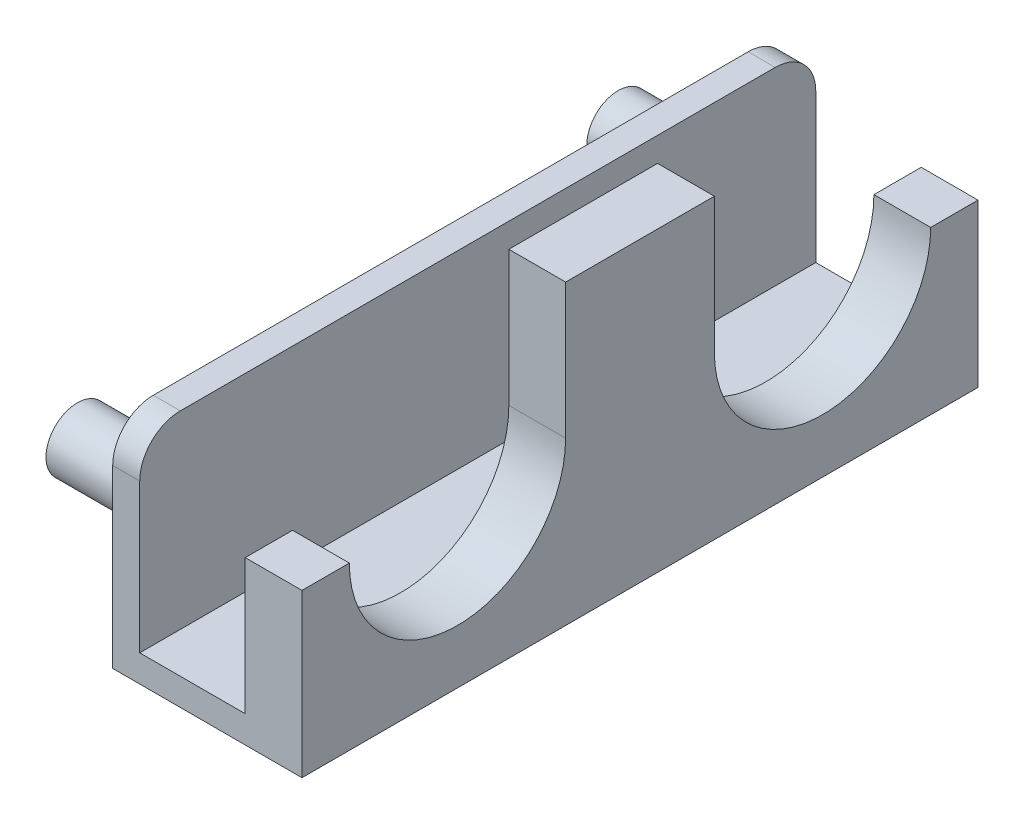
ISO-10303-21;
HEADER;
FILE_DESCRIPTION(('STEP AP214'),'2;1');
FILE_NAME('part.step','',(''),(''),'','','');
FILE_SCHEMA(('AUTOMOTIVE_DESIGN { 1 0 10303 214 1 1 1 1 }'));
ENDSEC;
DATA;
#1=APPLICATION_CONTEXT('core data for automotive mechanical design processes');
#2=APPLICATION_PROTOCOL_DEFINITION('international standard','automotive_design',2000,#1);
#3=PRODUCT_CONTEXT('',#1,'mechanical');
#4=PRODUCT('Part','Part','',(#3));
#5=PRODUCT_RELATED_PRODUCT_CATEGORY('part','',(#4));
#6=PRODUCT_DEFINITION_FORMATION('','',#4);
#7=PRODUCT_DEFINITION_CONTEXT('part definition',#1,'design');
#8=PRODUCT_DEFINITION('design','',#6,#7);
#9=PRODUCT_DEFINITION_SHAPE('','',#8);
#10=(LENGTH_UNIT() NAMED_UNIT(*) SI_UNIT(.MILLI.,.METRE.));
#11=(NAMED_UNIT(*) PLANE_ANGLE_UNIT() SI_UNIT($,.RADIAN.));
#12=(NAMED_UNIT(*) SI_UNIT($,.STERADIAN.) SOLID_ANGLE_UNIT());
#13=UNCERTAINTY_MEASURE_WITH_UNIT(LENGTH_MEASURE(1.E-05),#10,'distance_accuracy_value','');
#14=(GEOMETRIC_REPRESENTATION_CONTEXT(3) GLOBAL_UNCERTAINTY_ASSIGNED_CONTEXT((#13)) GLOBAL_UNIT_ASSIGNED_CONTEXT((#10,
#11,#12)) REPRESENTATION_CONTEXT('',''));
#15=CARTESIAN_POINT('',(0.,0.,0.));
#16=DIRECTION('',(0.,0.,1.));
#17=DIRECTION('',(1.,0.,0.));
#18=AXIS2_PLACEMENT_3D('',#15,#16,#17);
#19=CARTESIAN_POINT('',(0.,35.7792408647816,0.));
#20=DIRECTION('',(0.,-1.,0.));
#21=DIRECTION('',(0.,0.,-1.));
#22=AXIS2_PLACEMENT_3D('',#19,#20,#21);
#23=PLANE('',#22);
#24=DIRECTION('',(0.,0.,1.));
#25=VECTOR('',#24,1.);
#26=CARTESIAN_POINT('',(9.8,35.7792408647816,-112.54197556329));
#27=LINE('',#26,#25);
#28=CARTESIAN_POINT('',(9.8,35.7792408647816,-93.0419755632896));
#29=VERTEX_POINT('',#28);
#30=CARTESIAN_POINT('',(9.8,35.7792408647816,-82.0419755632896));
#31=VERTEX_POINT('',#30);
#32=EDGE_CURVE('E287',#29,#31,#27,.T.);
#33=ORIENTED_EDGE('',*,*,#32,.T.);
#34=DIRECTION('',(1.,0.,0.));
#35=VECTOR('',#34,1.);
#36=CARTESIAN_POINT('',(9.8,35.7792408647816,-82.0419755632896));
#37=LINE('',#36,#35);
#38=CARTESIAN_POINT('',(14.,35.7792408647816,-82.0419755632896));
#39=VERTEX_POINT('',#38);
#40=EDGE_CURVE('E499',#31,#39,#37,.T.);
#41=ORIENTED_EDGE('',*,*,#40,.T.);
#42=DIRECTION('',(0.,0.,-1.));
#43=VECTOR('',#42,1.);
#44=CARTESIAN_POINT('',(14.,35.7792408647816,-112.54197556329));
#45=LINE('',#44,#43);
#46=CARTESIAN_POINT('',(14.,35.7792408647816,-93.0419755632896));
#47=VERTEX_POINT('',#46);
#48=EDGE_CURVE('E284',#39,#47,#45,.T.);
#49=ORIENTED_EDGE('',*,*,#48,.T.);
#50=DIRECTION('',(1.,0.,0.));
#51=VECTOR('',#50,1.);
#52=CARTESIAN_POINT('',(9.8,35.7792408647816,-93.0419755632896));
#53=LINE('',#52,#51);
#54=EDGE_CURVE('E486',#29,#47,#53,.T.);
#55=ORIENTED_EDGE('',*,*,#54,.F.);
#56=EDGE_LOOP('',(#33,#41,#49,#55));
#57=FACE_BOUND('',#56,.T.);
#58=ADVANCED_FACE('F33',(#57),#23,.F.);
#59=CARTESIAN_POINT('',(14.,15.7792408647816,-62.5419755632896));
#60=DIRECTION('',(0.,-1.,0.));
#61=DIRECTION('',(0.,0.,-1.));
#62=AXIS2_PLACEMENT_3D('',#59,#60,#61);
#63=PLANE('',#62);
#64=DIRECTION('',(0.,0.,1.));
#65=VECTOR('',#64,1.);
#66=CARTESIAN_POINT('',(9.8,15.7792408647816,-112.54197556329));
#67=LINE('',#66,#65);
#68=CARTESIAN_POINT('',(9.8,15.7792408647816,-112.54197556329));
#69=VERTEX_POINT('',#68);
#70=CARTESIAN_POINT('',(9.80000000000001,15.7792408647816,-62.5419755632896));
#71=VERTEX_POINT('',#70);
#72=EDGE_CURVE('E277',#69,#71,#67,.T.);
#73=ORIENTED_EDGE('',*,*,#72,.F.);
#74=DIRECTION('',(-1.,0.,0.));
#75=VECTOR('',#74,1.);
#76=CARTESIAN_POINT('',(14.,15.7792408647816,-112.54197556329));
#77=LINE('',#76,#75);
#78=CARTESIAN_POINT('',(2.,15.7792408647816,-112.54197556329));
#79=VERTEX_POINT('',#78);
#80=EDGE_CURVE('E190',#69,#79,#77,.T.);
#81=ORIENTED_EDGE('',*,*,#80,.T.);
#82=DIRECTION('',(0.,0.,1.));
#83=VECTOR('',#82,1.);
#84=CARTESIAN_POINT('',(2.,15.7792408647816,-62.5419755632896));
#85=LINE('',#84,#83);
#86=CARTESIAN_POINT('',(2.,15.7792408647816,-62.5419755632896));
#87=VERTEX_POINT('',#86);
#88=EDGE_CURVE('E175',#79,#87,#85,.T.);
#89=ORIENTED_EDGE('',*,*,#88,.T.);
#90=DIRECTION('',(-1.,0.,0.));
#91=VECTOR('',#90,1.);
#92=CARTESIAN_POINT('',(14.,15.7792408647816,-62.5419755632896));
#93=LINE('',#92,#91);
#94=EDGE_CURVE('E186',#71,#87,#93,.T.);
#95=ORIENTED_EDGE('',*,*,#94,.F.);
#96=EDGE_LOOP('',(#73,#81,#89,#95));
#97=FACE_BOUND('',#96,.T.);
#98=ADVANCED_FACE('F298',(#97),#63,.F.);
#99=CARTESIAN_POINT('',(2.,0.,0.));
#100=DIRECTION('',(-1.,0.,0.));
#101=DIRECTION('',(0.,0.,1.));
#102=AXIS2_PLACEMENT_3D('',#99,#100,#101);
#103=PLANE('',#102);
#104=DIRECTION('',(0.,0.,1.));
#105=VECTOR('',#104,1.);
#106=CARTESIAN_POINT('',(2.,29.7792408647816,-112.54197556329));
#107=LINE('',#106,#105);
#108=CARTESIAN_POINT('',(2.,29.7792408647816,-109.54197556329));
#109=VERTEX_POINT('',#108);
#110=CARTESIAN_POINT('',(2.,29.7792408647816,-65.5419755632896));
#111=VERTEX_POINT('',#110);
#112=EDGE_CURVE('E207',#109,#111,#107,.T.);
#113=ORIENTED_EDGE('',*,*,#112,.T.);
#114=CARTESIAN_POINT('',(2.,26.7792408647816,-65.5419755632896));
#115=DIRECTION('',(-1.,0.,0.));
#116=DIRECTION('',(0.,0.,1.));
#117=AXIS2_PLACEMENT_3D('',#114,#115,#116);
#118=CIRCLE('',#117,3.);
#119=CARTESIAN_POINT('',(2.,26.7792408647816,-62.5419755632896));
#120=VERTEX_POINT('',#119);
#121=EDGE_CURVE('E41',#111,#120,#118,.F.);
#122=ORIENTED_EDGE('',*,*,#121,.T.);
#123=DIRECTION('',(0.,-1.,0.));
#124=VECTOR('',#123,1.);
#125=CARTESIAN_POINT('',(2.,29.7792408647816,-62.5419755632896));
#126=LINE('',#125,#124);
#127=EDGE_CURVE('E210',#120,#87,#126,.T.);
#128=ORIENTED_EDGE('',*,*,#127,.T.);
#129=ORIENTED_EDGE('',*,*,#88,.F.);
#130=DIRECTION('',(0.,1.,0.));
#131=VECTOR('',#130,1.);
#132=CARTESIAN_POINT('',(2.,29.7792408647816,-112.54197556329));
#133=LINE('',#132,#131);
#134=CARTESIAN_POINT('',(2.,26.7792408647816,-112.54197556329));
#135=VERTEX_POINT('',#134);
#136=EDGE_CURVE('E205',#79,#135,#133,.T.);
#137=ORIENTED_EDGE('',*,*,#136,.T.);
#138=CARTESIAN_POINT('',(2.,26.7792408647816,-109.54197556329));
#139=DIRECTION('',(-1.,0.,0.));
#140=DIRECTION('',(0.,0.,1.));
#141=AXIS2_PLACEMENT_3D('',#138,#139,#140);
#142=CIRCLE('',#141,3.);
#143=EDGE_CURVE('E233',#135,#109,#142,.F.);
#144=ORIENTED_EDGE('',*,*,#143,.T.);
#145=EDGE_LOOP('',(#113,#122,#128,#129,#137,#144));
#146=FACE_BOUND('',#145,.T.);
#147=ADVANCED_FACE('F237',(#146),#103,.F.);
#148=CARTESIAN_POINT('',(2.,29.7792408647816,-112.54197556329));
#149=DIRECTION('',(0.,0.,1.));
#150=DIRECTION('',(1.,0.,0.));
#151=AXIS2_PLACEMENT_3D('',#148,#149,#150);
#152=PLANE('',#151);
#153=DIRECTION('',(0.,-1.,0.));
#154=VECTOR('',#153,1.);
#155=CARTESIAN_POINT('',(9.8,35.7792408647816,-112.54197556329));
#156=LINE('',#155,#154);
#157=CARTESIAN_POINT('',(9.8,25.7792408647816,-112.54197556329));
#158=VERTEX_POINT('',#157);
#159=EDGE_CURVE('E180',#158,#69,#156,.T.);
#160=ORIENTED_EDGE('',*,*,#159,.F.);
#161=DIRECTION('',(1.,0.,0.));
#162=VECTOR('',#161,1.);
#163=CARTESIAN_POINT('',(4.,25.7792408647816,-112.54197556329));
#164=LINE('',#163,#162);
#165=CARTESIAN_POINT('',(14.,25.7792408647816,-112.54197556329));
#166=VERTEX_POINT('',#165);
#167=EDGE_CURVE('E168',#158,#166,#164,.T.);
#168=ORIENTED_EDGE('',*,*,#167,.T.);
#169=DIRECTION('',(0.,1.,0.));
#170=VECTOR('',#169,1.);
#171=CARTESIAN_POINT('',(14.,13.7792408647816,-112.54197556329));
#172=LINE('',#171,#170);
#173=CARTESIAN_POINT('',(14.,13.7792408647816,-112.54197556329));
#174=VERTEX_POINT('',#173);
#175=EDGE_CURVE('E177',#174,#166,#172,.T.);
#176=ORIENTED_EDGE('',*,*,#175,.F.);
#177=DIRECTION('',(-1.,0.,0.));
#178=VECTOR('',#177,1.);
#179=CARTESIAN_POINT('',(2.,13.7792408647816,-112.54197556329));
#180=LINE('',#179,#178);
#181=CARTESIAN_POINT('',(0.,13.7792408647816,-112.54197556329));
#182=VERTEX_POINT('',#181);
#183=EDGE_CURVE('E212',#174,#182,#180,.T.);
#184=ORIENTED_EDGE('',*,*,#183,.T.);
#185=DIRECTION('',(0.,1.,0.));
#186=VECTOR('',#185,1.);
#187=CARTESIAN_POINT('',(0.,29.7792408647816,-112.54197556329));
#188=LINE('',#187,#186);
#189=CARTESIAN_POINT('',(0.,26.7792408647816,-112.54197556329));
#190=VERTEX_POINT('',#189);
#191=EDGE_CURVE('E202',#182,#190,#188,.T.);
#192=ORIENTED_EDGE('',*,*,#191,.T.);
#193=DIRECTION('',(-1.,0.,0.));
#194=VECTOR('',#193,1.);
#195=CARTESIAN_POINT('',(2.,26.7792408647816,-112.54197556329));
#196=LINE('',#195,#194);
#197=EDGE_CURVE('E11',#190,#135,#196,.F.);
#198=ORIENTED_EDGE('',*,*,#197,.T.);
#199=ORIENTED_EDGE('',*,*,#136,.F.);
#200=ORIENTED_EDGE('',*,*,#80,.F.);
#201=EDGE_LOOP('',(#160,#168,#176,#184,#192,#198,#199,#200));
#202=FACE_BOUND('',#201,.T.);
#203=ADVANCED_FACE('F254',(#202),#152,.F.);
#204=CARTESIAN_POINT('',(2.,29.7792408647816,-112.54197556329));
#205=DIRECTION('',(0.,-1.,0.));
#206=DIRECTION('',(0.,0.,-1.));
#207=AXIS2_PLACEMENT_3D('',#204,#205,#206);
#208=PLANE('',#207);
#209=DIRECTION('',(0.,0.,1.));
#210=VECTOR('',#209,1.);
#211=CARTESIAN_POINT('',(0.,29.7792408647816,-112.54197556329));
#212=LINE('',#211,#210);
#213=CARTESIAN_POINT('',(0.,29.7792408647816,-109.54197556329));
#214=VERTEX_POINT('',#213);
#215=CARTESIAN_POINT('',(0.,29.7792408647816,-65.5419755632896));
#216=VERTEX_POINT('',#215);
#217=EDGE_CURVE('E214',#214,#216,#212,.T.);
#218=ORIENTED_EDGE('',*,*,#217,.T.);
#219=DIRECTION('',(-1.,0.,0.));
#220=VECTOR('',#219,1.);
#221=CARTESIAN_POINT('',(2.,29.7792408647816,-65.5419755632896));
#222=LINE('',#221,#220);
#223=EDGE_CURVE('E54',#216,#111,#222,.F.);
#224=ORIENTED_EDGE('',*,*,#223,.T.);
#225=ORIENTED_EDGE('',*,*,#112,.F.);
#226=DIRECTION('',(-1.,0.,0.));
#227=VECTOR('',#226,1.);
#228=CARTESIAN_POINT('',(2.,29.7792408647816,-109.54197556329));
#229=LINE('',#228,#227);
#230=EDGE_CURVE('E229',#109,#214,#229,.T.);
#231=ORIENTED_EDGE('',*,*,#230,.T.);
#232=EDGE_LOOP('',(#218,#224,#225,#231));
#233=FACE_BOUND('',#232,.T.);
#234=ADVANCED_FACE('F248',(#233),#208,.F.);
#235=CARTESIAN_POINT('',(2.,29.7792408647816,-62.5419755632896));
#236=DIRECTION('',(0.,0.,-1.));
#237=DIRECTION('',(-1.,0.,0.));
#238=AXIS2_PLACEMENT_3D('',#235,#236,#237);
#239=PLANE('',#238);
#240=DIRECTION('',(0.,-1.,0.));
#241=VECTOR('',#240,1.);
#242=CARTESIAN_POINT('',(14.,13.7792408647816,-62.5419755632896));
#243=LINE('',#242,#241);
#244=CARTESIAN_POINT('',(14.,25.7792408647816,-62.5419755632896));
#245=VERTEX_POINT('',#244);
#246=CARTESIAN_POINT('',(14.,13.7792408647816,-62.5419755632896));
#247=VERTEX_POINT('',#246);
#248=EDGE_CURVE('E163',#245,#247,#243,.T.);
#249=ORIENTED_EDGE('',*,*,#248,.F.);
#250=DIRECTION('',(1.,0.,0.));
#251=VECTOR('',#250,1.);
#252=CARTESIAN_POINT('',(4.,25.7792408647816,-62.5419755632896));
#253=LINE('',#252,#251);
#254=CARTESIAN_POINT('',(9.80000000000001,25.7792408647816,-62.5419755632896));
#255=VERTEX_POINT('',#254);
#256=EDGE_CURVE('E147',#255,#245,#253,.T.);
#257=ORIENTED_EDGE('',*,*,#256,.F.);
#258=DIRECTION('',(0.,-1.,0.));
#259=VECTOR('',#258,1.);
#260=CARTESIAN_POINT('',(9.80000000000001,35.7792408647816,-62.5419755632896));
#261=LINE('',#260,#259);
#262=EDGE_CURVE('E290',#255,#71,#261,.T.);
#263=ORIENTED_EDGE('',*,*,#262,.T.);
#264=ORIENTED_EDGE('',*,*,#94,.T.);
#265=ORIENTED_EDGE('',*,*,#127,.F.);
#266=DIRECTION('',(-1.,0.,0.));
#267=VECTOR('',#266,1.);
#268=CARTESIAN_POINT('',(2.,26.7792408647816,-62.5419755632896));
#269=LINE('',#268,#267);
#270=CARTESIAN_POINT('',(0.,26.7792408647816,-62.5419755632896));
#271=VERTEX_POINT('',#270);
#272=EDGE_CURVE('E222',#120,#271,#269,.T.);
#273=ORIENTED_EDGE('',*,*,#272,.T.);
#274=DIRECTION('',(0.,-1.,0.));
#275=VECTOR('',#274,1.);
#276=CARTESIAN_POINT('',(0.,29.7792408647816,-62.5419755632896));
#277=LINE('',#276,#275);
#278=CARTESIAN_POINT('',(0.,13.7792408647816,-62.5419755632896));
#279=VERTEX_POINT('',#278);
#280=EDGE_CURVE('E216',#271,#279,#277,.T.);
#281=ORIENTED_EDGE('',*,*,#280,.T.);
#282=DIRECTION('',(-1.,0.,0.));
#283=VECTOR('',#282,1.);
#284=CARTESIAN_POINT('',(2.,13.7792408647816,-62.5419755632896));
#285=LINE('',#284,#283);
#286=EDGE_CURVE('E172',#247,#279,#285,.T.);
#287=ORIENTED_EDGE('',*,*,#286,.F.);
#288=EDGE_LOOP('',(#249,#257,#263,#264,#265,#273,#281,#287));
#289=FACE_BOUND('',#288,.T.);
#290=ADVANCED_FACE('F170',(#289),#239,.F.);
#291=CARTESIAN_POINT('',(2.,13.7792408647816,-112.54197556329));
#292=DIRECTION('',(0.,1.,0.));
#293=DIRECTION('',(0.,0.,1.));
#294=AXIS2_PLACEMENT_3D('',#291,#292,#293);
#295=PLANE('',#294);
#296=DIRECTION('',(0.,0.,-1.));
#297=VECTOR('',#296,1.);
#298=CARTESIAN_POINT('',(0.,13.7792408647816,-112.54197556329));
#299=LINE('',#298,#297);
#300=EDGE_CURVE('E208',#279,#182,#299,.T.);
#301=ORIENTED_EDGE('',*,*,#300,.T.);
#302=ORIENTED_EDGE('',*,*,#183,.F.);
#303=DIRECTION('',(0.,0.,-1.));
#304=VECTOR('',#303,1.);
#305=CARTESIAN_POINT('',(14.,13.7792408647816,-62.5419755632896));
#306=LINE('',#305,#304);
#307=EDGE_CURVE('E174',#247,#174,#306,.T.);
#308=ORIENTED_EDGE('',*,*,#307,.F.);
#309=ORIENTED_EDGE('',*,*,#286,.T.);
#310=EDGE_LOOP('',(#301,#302,#308,#309));
#311=FACE_BOUND('',#310,.T.);
#312=ADVANCED_FACE('F258',(#311),#295,.F.);
#313=CARTESIAN_POINT('',(0.,0.,0.));
#314=DIRECTION('',(-1.,0.,0.));
#315=DIRECTION('',(0.,0.,1.));
#316=AXIS2_PLACEMENT_3D('',#313,#314,#315);
#317=PLANE('',#316);
#318=CARTESIAN_POINT('',(0.,21.7792408647816,-67.9333546535158));
#319=DIRECTION('',(-1.,0.,0.));
#320=DIRECTION('',(0.,0.,1.));
#321=AXIS2_PLACEMENT_3D('',#318,#319,#320);
#322=CIRCLE('',#321,2.32499999999999);
#323=CARTESIAN_POINT('',(0.,21.7792408647816,-65.6083546535158));
#324=VERTEX_POINT('',#323);
#325=EDGE_CURVE('E192',#324,#324,#322,.T.);
#326=ORIENTED_EDGE('',*,*,#325,.F.);
#327=EDGE_LOOP('',(#326));
#328=FACE_BOUND('',#327,.T.);
#329=CARTESIAN_POINT('',(0.,21.7792408647816,-107.933354653516));
#330=DIRECTION('',(-1.,0.,0.));
#331=DIRECTION('',(0.,0.,1.));
#332=AXIS2_PLACEMENT_3D('',#329,#330,#331);
#333=CIRCLE('',#332,2.32499999999999);
#334=CARTESIAN_POINT('',(0.,21.7792408647816,-105.608354653516));
#335=VERTEX_POINT('',#334);
#336=EDGE_CURVE('E196',#335,#335,#333,.T.);
#337=ORIENTED_EDGE('',*,*,#336,.F.);
#338=EDGE_LOOP('',(#337));
#339=FACE_BOUND('',#338,.T.);
#340=ORIENTED_EDGE('',*,*,#280,.F.);
#341=CARTESIAN_POINT('',(0.,26.7792408647816,-65.5419755632896));
#342=DIRECTION('',(-1.,0.,0.));
#343=DIRECTION('',(0.,0.,1.));
#344=AXIS2_PLACEMENT_3D('',#341,#342,#343);
#345=CIRCLE('',#344,3.);
#346=EDGE_CURVE('E227',#271,#216,#345,.T.);
#347=ORIENTED_EDGE('',*,*,#346,.T.);
#348=ORIENTED_EDGE('',*,*,#217,.F.);
#349=CARTESIAN_POINT('',(0.,26.7792408647816,-109.54197556329));
#350=DIRECTION('',(-1.,0.,0.));
#351=DIRECTION('',(0.,0.,1.));
#352=AXIS2_PLACEMENT_3D('',#349,#350,#351);
#353=CIRCLE('',#352,3.);
#354=EDGE_CURVE('E225',#214,#190,#353,.T.);
#355=ORIENTED_EDGE('',*,*,#354,.T.);
#356=ORIENTED_EDGE('',*,*,#191,.F.);
#357=ORIENTED_EDGE('',*,*,#300,.F.);
#358=EDGE_LOOP('',(#340,#347,#348,#355,#356,#357));
#359=FACE_BOUND('',#358,.T.);
#360=ADVANCED_FACE('F246',(#328,#339,#359),#317,.T.);
#361=CARTESIAN_POINT('',(-8.,21.7792408647816,-107.933354653516));
#362=DIRECTION('',(1.,0.,0.));
#363=DIRECTION('',(0.,0.,-1.));
#364=AXIS2_PLACEMENT_3D('',#361,#362,#363);
#365=CYLINDRICAL_SURFACE('',#364,2.32499999999999);
#366=CARTESIAN_POINT('',(-8.,21.7792408647816,-107.933354653516));
#367=DIRECTION('',(-1.,0.,0.));
#368=DIRECTION('',(0.,0.,1.));
#369=AXIS2_PLACEMENT_3D('',#366,#367,#368);
#370=CIRCLE('',#369,2.32499999999999);
#371=CARTESIAN_POINT('',(-8.,21.7792408647816,-105.608354653516));
#372=VERTEX_POINT('',#371);
#373=EDGE_CURVE('E199',#372,#372,#370,.T.);
#374=ORIENTED_EDGE('',*,*,#373,.F.);
#375=EDGE_LOOP('',(#374));
#376=FACE_BOUND('',#375,.T.);
#377=ORIENTED_EDGE('',*,*,#336,.T.);
#378=EDGE_LOOP('',(#377));
#379=FACE_BOUND('',#378,.T.);
#380=ADVANCED_FACE('F322',(#376,#379),#365,.T.);
#381=CARTESIAN_POINT('',(-8.,21.7792408647816,-107.933354653516));
#382=DIRECTION('',(-1.,0.,0.));
#383=DIRECTION('',(0.,0.,1.));
#384=AXIS2_PLACEMENT_3D('',#381,#382,#383);
#385=PLANE('',#384);
#386=ORIENTED_EDGE('',*,*,#373,.T.);
#387=EDGE_LOOP('',(#386));
#388=FACE_BOUND('',#387,.T.);
#389=ADVANCED_FACE('F318',(#388),#385,.T.);
#390=CARTESIAN_POINT('',(-8.,21.7792408647816,-67.9333546535158));
#391=DIRECTION('',(1.,0.,0.));
#392=DIRECTION('',(0.,0.,-1.));
#393=AXIS2_PLACEMENT_3D('',#390,#391,#392);
#394=CYLINDRICAL_SURFACE('',#393,2.32499999999999);
#395=CARTESIAN_POINT('',(-8.,21.7792408647816,-67.9333546535158));
#396=DIRECTION('',(-1.,0.,0.));
#397=DIRECTION('',(0.,0.,1.));
#398=AXIS2_PLACEMENT_3D('',#395,#396,#397);
#399=CIRCLE('',#398,2.32499999999999);
#400=CARTESIAN_POINT('',(-8.,21.7792408647816,-65.6083546535158));
#401=VERTEX_POINT('',#400);
#402=EDGE_CURVE('E193',#401,#401,#399,.T.);
#403=ORIENTED_EDGE('',*,*,#402,.F.);
#404=EDGE_LOOP('',(#403));
#405=FACE_BOUND('',#404,.T.);
#406=ORIENTED_EDGE('',*,*,#325,.T.);
#407=EDGE_LOOP('',(#406));
#408=FACE_BOUND('',#407,.T.);
#409=ADVANCED_FACE('F314',(#405,#408),#394,.T.);
#410=CARTESIAN_POINT('',(-8.,21.7792408647816,-67.9333546535158));
#411=DIRECTION('',(-1.,0.,0.));
#412=DIRECTION('',(0.,0.,1.));
#413=AXIS2_PLACEMENT_3D('',#410,#411,#412);
#414=PLANE('',#413);
#415=ORIENTED_EDGE('',*,*,#402,.T.);
#416=EDGE_LOOP('',(#415));
#417=FACE_BOUND('',#416,.T.);
#418=ADVANCED_FACE('F311',(#417),#414,.T.);
#419=CARTESIAN_POINT('',(14.,0.,0.));
#420=DIRECTION('',(-1.,0.,0.));
#421=DIRECTION('',(0.,0.,1.));
#422=AXIS2_PLACEMENT_3D('',#419,#420,#421);
#423=PLANE('',#422);
#424=CARTESIAN_POINT('',(14.,25.7792408647816,-74.0419755632896));
#425=DIRECTION('',(-1.,0.,0.));
#426=DIRECTION('',(0.,0.,1.));
#427=AXIS2_PLACEMENT_3D('',#424,#425,#426);
#428=CIRCLE('',#427,8.00000000000001);
#429=CARTESIAN_POINT('',(14.,25.7792408647816,-66.0419755632896));
#430=VERTEX_POINT('',#429);
#431=CARTESIAN_POINT('',(14.,25.7792408647816,-82.0419755632896));
#432=VERTEX_POINT('',#431);
#433=EDGE_CURVE('E167',#430,#432,#428,.F.);
#434=ORIENTED_EDGE('',*,*,#433,.F.);
#435=DIRECTION('',(0.,0.,-1.));
#436=VECTOR('',#435,1.);
#437=CARTESIAN_POINT('',(14.,25.7792408647816,-66.0419755632896));
#438=LINE('',#437,#436);
#439=EDGE_CURVE('E150',#245,#430,#438,.T.);
#440=ORIENTED_EDGE('',*,*,#439,.F.);
#441=ORIENTED_EDGE('',*,*,#248,.T.);
#442=ORIENTED_EDGE('',*,*,#307,.T.);
#443=ORIENTED_EDGE('',*,*,#175,.T.);
#444=DIRECTION('',(0.,0.,-1.));
#445=VECTOR('',#444,1.);
#446=CARTESIAN_POINT('',(14.,25.7792408647816,-109.04197556329));
#447=LINE('',#446,#445);
#448=CARTESIAN_POINT('',(14.,25.7792408647816,-109.04197556329));
#449=VERTEX_POINT('',#448);
#450=EDGE_CURVE('E261',#449,#166,#447,.T.);
#451=ORIENTED_EDGE('',*,*,#450,.F.);
#452=CARTESIAN_POINT('',(14.,25.7792408647816,-101.04197556329));
#453=DIRECTION('',(-1.,0.,0.));
#454=DIRECTION('',(0.,0.,1.));
#455=AXIS2_PLACEMENT_3D('',#452,#453,#454);
#456=CIRCLE('',#455,8.00000000000001);
#457=CARTESIAN_POINT('',(14.,25.7792408647816,-93.0419755632896));
#458=VERTEX_POINT('',#457);
#459=EDGE_CURVE('E264',#458,#449,#456,.F.);
#460=ORIENTED_EDGE('',*,*,#459,.F.);
#461=DIRECTION('',(0.,-1.,0.));
#462=VECTOR('',#461,1.);
#463=CARTESIAN_POINT('',(14.,25.7792408647816,-93.0419755632896));
#464=LINE('',#463,#462);
#465=EDGE_CURVE('E491',#47,#458,#464,.T.);
#466=ORIENTED_EDGE('',*,*,#465,.F.);
#467=ORIENTED_EDGE('',*,*,#48,.F.);
#468=DIRECTION('',(0.,1.,0.));
#469=VECTOR('',#468,1.);
#470=CARTESIAN_POINT('',(14.,35.7792408647816,-82.0419755632896));
#471=LINE('',#470,#469);
#472=EDGE_CURVE('E495',#432,#39,#471,.T.);
#473=ORIENTED_EDGE('',*,*,#472,.F.);
#474=EDGE_LOOP('',(#434,#440,#441,#442,#443,#451,#460,#466,#467,#473));
#475=FACE_BOUND('',#474,.T.);
#476=ADVANCED_FACE('F161',(#475),#423,.F.);
#477=CARTESIAN_POINT('',(9.8,35.7792408647816,-112.54197556329));
#478=DIRECTION('',(1.,0.,0.));
#479=DIRECTION('',(0.,0.,-1.));
#480=AXIS2_PLACEMENT_3D('',#477,#478,#479);
#481=PLANE('',#480);
#482=ORIENTED_EDGE('',*,*,#262,.F.);
#483=DIRECTION('',(0.,0.,-1.));
#484=VECTOR('',#483,1.);
#485=CARTESIAN_POINT('',(9.8,25.7792408647816,-112.54197556329));
#486=LINE('',#485,#484);
#487=CARTESIAN_POINT('',(9.8,25.7792408647816,-66.0419755632896));
#488=VERTEX_POINT('',#487);
#489=EDGE_CURVE('E153',#255,#488,#486,.T.);
#490=ORIENTED_EDGE('',*,*,#489,.T.);
#491=CARTESIAN_POINT('',(9.8,25.7792408647816,-74.0419755632896));
#492=DIRECTION('',(1.,0.,0.));
#493=DIRECTION('',(0.,0.,-1.));
#494=AXIS2_PLACEMENT_3D('',#491,#492,#493);
#495=CIRCLE('',#494,8.00000000000001);
#496=CARTESIAN_POINT('',(9.8,25.7792408647816,-82.0419755632896));
#497=VERTEX_POINT('',#496);
#498=EDGE_CURVE('E275',#488,#497,#495,.T.);
#499=ORIENTED_EDGE('',*,*,#498,.T.);
#500=DIRECTION('',(0.,1.,0.));
#501=VECTOR('',#500,1.);
#502=CARTESIAN_POINT('',(9.8,35.7792408647816,-82.0419755632896));
#503=LINE('',#502,#501);
#504=EDGE_CURVE('E500',#497,#31,#503,.T.);
#505=ORIENTED_EDGE('',*,*,#504,.T.);
#506=ORIENTED_EDGE('',*,*,#32,.F.);
#507=DIRECTION('',(0.,-1.,0.));
#508=VECTOR('',#507,1.);
#509=CARTESIAN_POINT('',(9.8,25.7792408647816,-93.0419755632896));
#510=LINE('',#509,#508);
#511=CARTESIAN_POINT('',(9.8,25.7792408647816,-93.0419755632896));
#512=VERTEX_POINT('',#511);
#513=EDGE_CURVE('E487',#29,#512,#510,.T.);
#514=ORIENTED_EDGE('',*,*,#513,.T.);
#515=CARTESIAN_POINT('',(9.8,25.7792408647816,-101.04197556329));
#516=DIRECTION('',(1.,0.,0.));
#517=DIRECTION('',(0.,0.,-1.));
#518=AXIS2_PLACEMENT_3D('',#515,#516,#517);
#519=CIRCLE('',#518,8.00000000000001);
#520=CARTESIAN_POINT('',(9.8,25.7792408647816,-109.04197556329));
#521=VERTEX_POINT('',#520);
#522=EDGE_CURVE('E280',#512,#521,#519,.T.);
#523=ORIENTED_EDGE('',*,*,#522,.T.);
#524=DIRECTION('',(0.,0.,-1.));
#525=VECTOR('',#524,1.);
#526=CARTESIAN_POINT('',(9.8,25.7792408647816,-112.54197556329));
#527=LINE('',#526,#525);
#528=EDGE_CURVE('E157',#521,#158,#527,.T.);
#529=ORIENTED_EDGE('',*,*,#528,.T.);
#530=ORIENTED_EDGE('',*,*,#159,.T.);
#531=ORIENTED_EDGE('',*,*,#72,.T.);
#532=EDGE_LOOP('',(#482,#490,#499,#505,#506,#514,#523,#529,#530,#531));
#533=FACE_BOUND('',#532,.T.);
#534=ADVANCED_FACE('F295',(#533),#481,.F.);
#535=CARTESIAN_POINT('',(14.000012,25.7792408647816,-101.04197556329));
#536=DIRECTION('',(-1.,0.,0.));
#537=DIRECTION('',(0.,0.,1.));
#538=AXIS2_PLACEMENT_3D('',#535,#536,#537);
#539=CYLINDRICAL_SURFACE('',#538,8.00000000000001);
#540=DIRECTION('',(1.,0.,0.));
#541=VECTOR('',#540,1.);
#542=CARTESIAN_POINT('',(9.8,25.7792408647816,-93.0419755632896));
#543=LINE('',#542,#541);
#544=EDGE_CURVE('E274',#512,#458,#543,.T.);
#545=ORIENTED_EDGE('',*,*,#544,.T.);
#546=ORIENTED_EDGE('',*,*,#459,.T.);
#547=DIRECTION('',(1.,0.,0.));
#548=VECTOR('',#547,1.);
#549=CARTESIAN_POINT('',(9.8,25.7792408647816,-109.04197556329));
#550=LINE('',#549,#548);
#551=EDGE_CURVE('E272',#521,#449,#550,.T.);
#552=ORIENTED_EDGE('',*,*,#551,.F.);
#553=ORIENTED_EDGE('',*,*,#522,.F.);
#554=EDGE_LOOP('',(#545,#546,#552,#553));
#555=FACE_BOUND('',#554,.T.);
#556=ADVANCED_FACE('F270',(#555),#539,.F.);
#557=CARTESIAN_POINT('',(14.000012,25.7792408647816,-74.0419755632896));
#558=DIRECTION('',(-1.,0.,0.));
#559=DIRECTION('',(0.,0.,1.));
#560=AXIS2_PLACEMENT_3D('',#557,#558,#559);
#561=CYLINDRICAL_SURFACE('',#560,8.00000000000001);
#562=DIRECTION('',(1.,0.,0.));
#563=VECTOR('',#562,1.);
#564=CARTESIAN_POINT('',(9.8,25.7792408647816,-66.0419755632896));
#565=LINE('',#564,#563);
#566=EDGE_CURVE('E503',#488,#430,#565,.T.);
#567=ORIENTED_EDGE('',*,*,#566,.T.);
#568=ORIENTED_EDGE('',*,*,#433,.T.);
#569=DIRECTION('',(1.,0.,0.));
#570=VECTOR('',#569,1.);
#571=CARTESIAN_POINT('',(9.8,25.7792408647816,-82.0419755632896));
#572=LINE('',#571,#570);
#573=EDGE_CURVE('E497',#497,#432,#572,.T.);
#574=ORIENTED_EDGE('',*,*,#573,.F.);
#575=ORIENTED_EDGE('',*,*,#498,.F.);
#576=EDGE_LOOP('',(#567,#568,#574,#575));
#577=FACE_BOUND('',#576,.T.);
#578=ADVANCED_FACE('F350',(#577),#561,.F.);
#579=CARTESIAN_POINT('',(9.8,35.7792408647816,-82.0419755632896));
#580=DIRECTION('',(0.,0.,-1.));
#581=DIRECTION('',(-1.,0.,0.));
#582=AXIS2_PLACEMENT_3D('',#579,#580,#581);
#583=PLANE('',#582);
#584=ORIENTED_EDGE('',*,*,#472,.T.);
#585=ORIENTED_EDGE('',*,*,#40,.F.);
#586=ORIENTED_EDGE('',*,*,#504,.F.);
#587=ORIENTED_EDGE('',*,*,#573,.T.);
#588=EDGE_LOOP('',(#584,#585,#586,#587));
#589=FACE_BOUND('',#588,.T.);
#590=ADVANCED_FACE('F344',(#589),#583,.F.);
#591=CARTESIAN_POINT('',(9.8,25.7792408647816,-93.0419755632896));
#592=DIRECTION('',(0.,0.,1.));
#593=DIRECTION('',(1.,0.,0.));
#594=AXIS2_PLACEMENT_3D('',#591,#592,#593);
#595=PLANE('',#594);
#596=ORIENTED_EDGE('',*,*,#465,.T.);
#597=ORIENTED_EDGE('',*,*,#544,.F.);
#598=ORIENTED_EDGE('',*,*,#513,.F.);
#599=ORIENTED_EDGE('',*,*,#54,.T.);
#600=EDGE_LOOP('',(#596,#597,#598,#599));
#601=FACE_BOUND('',#600,.T.);
#602=ADVANCED_FACE('F338',(#601),#595,.F.);
#603=CARTESIAN_POINT('',(2.,26.7792408647816,-65.5419755632896));
#604=DIRECTION('',(-1.,0.,0.));
#605=DIRECTION('',(0.,0.,1.));
#606=AXIS2_PLACEMENT_3D('',#603,#604,#605);
#607=CYLINDRICAL_SURFACE('',#606,3.);
#608=ORIENTED_EDGE('',*,*,#121,.F.);
#609=ORIENTED_EDGE('',*,*,#223,.F.);
#610=ORIENTED_EDGE('',*,*,#346,.F.);
#611=ORIENTED_EDGE('',*,*,#272,.F.);
#612=EDGE_LOOP('',(#608,#609,#610,#611));
#613=FACE_BOUND('',#612,.T.);
#614=ADVANCED_FACE('F243',(#613),#607,.T.);
#615=CARTESIAN_POINT('',(2.,26.7792408647816,-109.54197556329));
#616=DIRECTION('',(-1.,0.,0.));
#617=DIRECTION('',(0.,0.,1.));
#618=AXIS2_PLACEMENT_3D('',#615,#616,#617);
#619=CYLINDRICAL_SURFACE('',#618,3.);
#620=ORIENTED_EDGE('',*,*,#143,.F.);
#621=ORIENTED_EDGE('',*,*,#197,.F.);
#622=ORIENTED_EDGE('',*,*,#354,.F.);
#623=ORIENTED_EDGE('',*,*,#230,.F.);
#624=EDGE_LOOP('',(#620,#621,#622,#623));
#625=FACE_BOUND('',#624,.T.);
#626=ADVANCED_FACE('F35',(#625),#619,.T.);
#627=CARTESIAN_POINT('',(4.,25.7792408647816,-109.04197556329));
#628=DIRECTION('',(0.,-1.,0.));
#629=DIRECTION('',(0.,0.,-1.));
#630=AXIS2_PLACEMENT_3D('',#627,#628,#629);
#631=PLANE('',#630);
#632=ORIENTED_EDGE('',*,*,#551,.T.);
#633=ORIENTED_EDGE('',*,*,#450,.T.);
#634=ORIENTED_EDGE('',*,*,#167,.F.);
#635=ORIENTED_EDGE('',*,*,#528,.F.);
#636=EDGE_LOOP('',(#632,#633,#634,#635));
#637=FACE_BOUND('',#636,.T.);
#638=ADVANCED_FACE('F343',(#637),#631,.F.);
#639=CARTESIAN_POINT('',(4.,25.7792408647816,-66.0419755632896));
#640=DIRECTION('',(0.,-1.,0.));
#641=DIRECTION('',(0.,0.,-1.));
#642=AXIS2_PLACEMENT_3D('',#639,#640,#641);
#643=PLANE('',#642);
#644=ORIENTED_EDGE('',*,*,#256,.T.);
#645=ORIENTED_EDGE('',*,*,#439,.T.);
#646=ORIENTED_EDGE('',*,*,#566,.F.);
#647=ORIENTED_EDGE('',*,*,#489,.F.);
#648=EDGE_LOOP('',(#644,#645,#646,#647));
#649=FACE_BOUND('',#648,.T.);
#650=ADVANCED_FACE('F149',(#649),#643,.F.);
#651=CLOSED_SHELL('',(#58,#98,#147,#203,#234,#290,#312,#360,#380,#389,#409,#418,#476,#534,#556,
#578,#590,#602,#614,#626,#638,#650));
#652=MANIFOLD_SOLID_BREP('B2',#651);
#653=ADVANCED_BREP_SHAPE_REPRESENTATION('',(#18,#652),#14);
#654=SHAPE_DEFINITION_REPRESENTATION(#9,#653);
ENDSEC;
END-ISO-10303-21;
